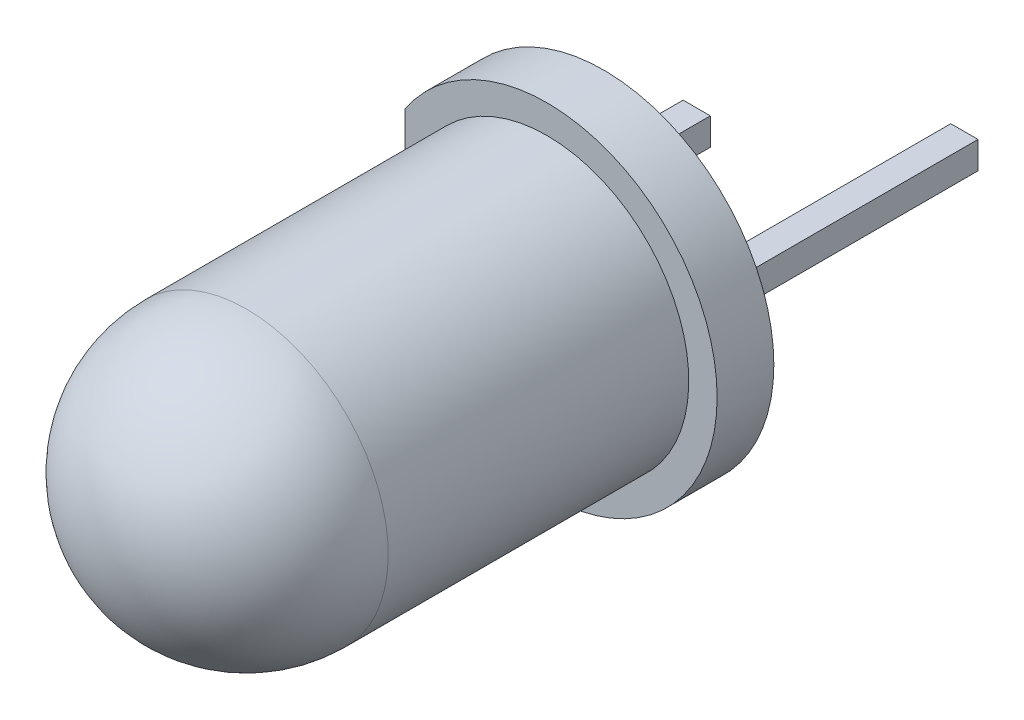
ISO-10303-21;
HEADER;
FILE_DESCRIPTION(('STEP AP214'),'2;1');
FILE_NAME('part.step','',(''),(''),'','','');
FILE_SCHEMA(('AUTOMOTIVE_DESIGN { 1 0 10303 214 1 1 1 1 }'));
ENDSEC;
DATA;
#1=APPLICATION_CONTEXT('core data for automotive mechanical design processes');
#2=APPLICATION_PROTOCOL_DEFINITION('international standard','automotive_design',2000,#1);
#3=PRODUCT_CONTEXT('',#1,'mechanical');
#4=PRODUCT('Part','Part','',(#3));
#5=PRODUCT_RELATED_PRODUCT_CATEGORY('part','',(#4));
#6=PRODUCT_DEFINITION_FORMATION('','',#4);
#7=PRODUCT_DEFINITION_CONTEXT('part definition',#1,'design');
#8=PRODUCT_DEFINITION('design','',#6,#7);
#9=PRODUCT_DEFINITION_SHAPE('','',#8);
#10=(LENGTH_UNIT() NAMED_UNIT(*) SI_UNIT(.MILLI.,.METRE.));
#11=(NAMED_UNIT(*) PLANE_ANGLE_UNIT() SI_UNIT($,.RADIAN.));
#12=(NAMED_UNIT(*) SI_UNIT($,.STERADIAN.) SOLID_ANGLE_UNIT());
#13=UNCERTAINTY_MEASURE_WITH_UNIT(LENGTH_MEASURE(1.E-05),#10,'distance_accuracy_value','');
#14=(GEOMETRIC_REPRESENTATION_CONTEXT(3) GLOBAL_UNCERTAINTY_ASSIGNED_CONTEXT((#13)) GLOBAL_UNIT_ASSIGNED_CONTEXT((#10,
#11,#12)) REPRESENTATION_CONTEXT('',''));
#15=CARTESIAN_POINT('',(0.,0.,0.));
#16=DIRECTION('',(0.,0.,1.));
#17=DIRECTION('',(1.,0.,0.));
#18=AXIS2_PLACEMENT_3D('',#15,#16,#17);
#19=CARTESIAN_POINT('',(-0.0499999999999997,0.,4.26666666666667));
#20=DIRECTION('',(0.,0.,1.));
#21=DIRECTION('',(-1.,0.,0.));
#22=AXIS2_PLACEMENT_3D('',#19,#20,#21);
#23=SPHERICAL_SURFACE('',#22,0.566666666666667);
#24=CARTESIAN_POINT('',(-0.0499999999999997,-0.24,4.26666666666667));
#25=DIRECTION('',(0.,1.,0.));
#26=DIRECTION('',(0.,0.,1.));
#27=AXIS2_PLACEMENT_3D('',#24,#25,#26);
#28=CIRCLE('',#27,0.513333333333333);
#29=CARTESIAN_POINT('',(-0.488634243989226,-0.24,4.));
#30=VERTEX_POINT('',#29);
#31=CARTESIAN_POINT('',(0.388634243989226,-0.24,4.));
#32=VERTEX_POINT('',#31);
#33=EDGE_CURVE('E161',#30,#32,#28,.F.);
#34=ORIENTED_EDGE('',*,*,#33,.T.);
#35=CARTESIAN_POINT('',(-0.0499999999999997,0.,4.));
#36=DIRECTION('',(0.,0.,1.));
#37=DIRECTION('',(1.,0.,0.));
#38=AXIS2_PLACEMENT_3D('',#35,#36,#37);
#39=CIRCLE('',#38,0.5);
#40=EDGE_CURVE('E56',#30,#32,#39,.T.);
#41=ORIENTED_EDGE('',*,*,#40,.F.);
#42=EDGE_LOOP('',(#34,#41));
#43=FACE_BOUND('',#42,.T.);
#44=ADVANCED_FACE('F48',(#43),#23,.T.);
#45=CARTESIAN_POINT('',(0.388634243989226,0.24,4.));
#46=VERTEX_POINT('',#45);
#47=CARTESIAN_POINT('',(-0.488634243989226,0.24,4.));
#48=VERTEX_POINT('',#47);
#49=EDGE_CURVE('E12',#46,#48,#39,.T.);
#50=ORIENTED_EDGE('',*,*,#49,.F.);
#51=CARTESIAN_POINT('',(-0.0499999999999997,0.24,4.26666666666667));
#52=DIRECTION('',(0.,1.,0.));
#53=DIRECTION('',(0.,0.,1.));
#54=AXIS2_PLACEMENT_3D('',#51,#52,#53);
#55=CIRCLE('',#54,0.513333333333333);
#56=EDGE_CURVE('E183',#48,#46,#55,.F.);
#57=ORIENTED_EDGE('',*,*,#56,.F.);
#58=EDGE_LOOP('',(#50,#57));
#59=FACE_BOUND('',#58,.T.);
#60=ADVANCED_FACE('F50',(#59),#23,.T.);
#61=CARTESIAN_POINT('',(-0.55,0.,4.));
#62=DIRECTION('',(0.,0.,-1.));
#63=DIRECTION('',(-1.,0.,0.));
#64=AXIS2_PLACEMENT_3D('',#61,#62,#63);
#65=PLANE('',#64);
#66=CARTESIAN_POINT('',(-0.0499999999999997,0.,4.));
#67=DIRECTION('',(0.,0.,1.));
#68=DIRECTION('',(1.,0.,0.));
#69=AXIS2_PLACEMENT_3D('',#66,#67,#68);
#70=CIRCLE('',#69,0.2);
#71=CARTESIAN_POINT('',(0.15,0.,4.));
#72=VERTEX_POINT('',#71);
#73=EDGE_CURVE('E256',#72,#72,#70,.T.);
#74=ORIENTED_EDGE('',*,*,#73,.F.);
#75=EDGE_LOOP('',(#74));
#76=FACE_BOUND('',#75,.T.);
#77=ORIENTED_EDGE('',*,*,#49,.T.);
#78=DIRECTION('',(1.,0.,0.));
#79=VECTOR('',#78,1.);
#80=CARTESIAN_POINT('',(-1.3,0.24,4.));
#81=LINE('',#80,#79);
#82=CARTESIAN_POINT('',(-1.3,0.24,4.));
#83=VERTEX_POINT('',#82);
#84=EDGE_CURVE('E102',#83,#48,#81,.T.);
#85=ORIENTED_EDGE('',*,*,#84,.F.);
#86=DIRECTION('',(0.,-1.,0.));
#87=VECTOR('',#86,1.);
#88=CARTESIAN_POINT('',(-1.3,0.24,4.));
#89=LINE('',#88,#87);
#90=CARTESIAN_POINT('',(-1.3,-0.24,4.));
#91=VERTEX_POINT('',#90);
#92=EDGE_CURVE('E160',#83,#91,#89,.T.);
#93=ORIENTED_EDGE('',*,*,#92,.T.);
#94=DIRECTION('',(1.,0.,0.));
#95=VECTOR('',#94,1.);
#96=CARTESIAN_POINT('',(-1.3,-0.24,4.));
#97=LINE('',#96,#95);
#98=EDGE_CURVE('E63',#91,#30,#97,.T.);
#99=ORIENTED_EDGE('',*,*,#98,.T.);
#100=ORIENTED_EDGE('',*,*,#40,.T.);
#101=CARTESIAN_POINT('',(1.2,-0.24,4.));
#102=VERTEX_POINT('',#101);
#103=EDGE_CURVE('E146',#32,#102,#97,.T.);
#104=ORIENTED_EDGE('',*,*,#103,.T.);
#105=DIRECTION('',(0.,-1.,0.));
#106=VECTOR('',#105,1.);
#107=CARTESIAN_POINT('',(1.2,0.24,4.));
#108=LINE('',#107,#106);
#109=CARTESIAN_POINT('',(1.2,0.24,4.));
#110=VERTEX_POINT('',#109);
#111=EDGE_CURVE('E130',#110,#102,#108,.T.);
#112=ORIENTED_EDGE('',*,*,#111,.F.);
#113=EDGE_CURVE('E118',#46,#110,#81,.T.);
#114=ORIENTED_EDGE('',*,*,#113,.F.);
#115=EDGE_LOOP('',(#77,#85,#93,#99,#100,#104,#112,#114));
#116=FACE_BOUND('',#115,.T.);
#117=ADVANCED_FACE('F166',(#76,#116),#65,.F.);
#118=CARTESIAN_POINT('',(0.,0.24,0.));
#119=DIRECTION('',(0.,1.,0.));
#120=DIRECTION('',(0.,0.,1.));
#121=AXIS2_PLACEMENT_3D('',#118,#119,#120);
#122=PLANE('',#121);
#123=ORIENTED_EDGE('',*,*,#84,.T.);
#124=ORIENTED_EDGE('',*,*,#56,.T.);
#125=ORIENTED_EDGE('',*,*,#113,.T.);
#126=DIRECTION('',(-0.508148861978286,0.,-0.861269257590315));
#127=VECTOR('',#126,1.);
#128=CARTESIAN_POINT('',(1.2,0.24,4.));
#129=LINE('',#128,#127);
#130=CARTESIAN_POINT('',(0.0199999999999998,0.24,2.));
#131=VERTEX_POINT('',#130);
#132=EDGE_CURVE('E109',#110,#131,#129,.T.);
#133=ORIENTED_EDGE('',*,*,#132,.T.);
#134=DIRECTION('',(-1.,0.,0.));
#135=VECTOR('',#134,1.);
#136=CARTESIAN_POINT('',(0.0199999999999998,0.24,2.));
#137=LINE('',#136,#135);
#138=CARTESIAN_POINT('',(-1.12,0.24,2.));
#139=VERTEX_POINT('',#138);
#140=EDGE_CURVE('E114',#131,#139,#137,.T.);
#141=ORIENTED_EDGE('',*,*,#140,.T.);
#142=DIRECTION('',(0.,0.,-1.));
#143=VECTOR('',#142,1.);
#144=CARTESIAN_POINT('',(-1.12,0.24,2.));
#145=LINE('',#144,#143);
#146=CARTESIAN_POINT('',(-1.12,0.24,-3.));
#147=VERTEX_POINT('',#146);
#148=EDGE_CURVE('E136',#139,#147,#145,.T.);
#149=ORIENTED_EDGE('',*,*,#148,.T.);
#150=DIRECTION('',(1.,0.,0.));
#151=VECTOR('',#150,1.);
#152=CARTESIAN_POINT('',(-1.12,0.24,-3.));
#153=LINE('',#152,#151);
#154=CARTESIAN_POINT('',(-1.6,0.24,-3.));
#155=VERTEX_POINT('',#154);
#156=EDGE_CURVE('E147',#155,#147,#153,.T.);
#157=ORIENTED_EDGE('',*,*,#156,.F.);
#158=DIRECTION('',(0.,0.,1.));
#159=VECTOR('',#158,1.);
#160=CARTESIAN_POINT('',(-1.6,0.24,0.));
#161=LINE('',#160,#159);
#162=CARTESIAN_POINT('',(-1.6,0.24,3.5));
#163=VERTEX_POINT('',#162);
#164=EDGE_CURVE('E72',#155,#163,#161,.T.);
#165=ORIENTED_EDGE('',*,*,#164,.T.);
#166=DIRECTION('',(0.514495755427526,0.,0.857492925712544));
#167=VECTOR('',#166,1.);
#168=CARTESIAN_POINT('',(-1.6,0.24,3.5));
#169=LINE('',#168,#167);
#170=EDGE_CURVE('E156',#163,#83,#169,.T.);
#171=ORIENTED_EDGE('',*,*,#170,.T.);
#172=EDGE_LOOP('',(#123,#124,#125,#133,#141,#149,#157,#165,#171));
#173=FACE_BOUND('',#172,.T.);
#174=ADVANCED_FACE('F111',(#173),#122,.T.);
#175=CARTESIAN_POINT('',(0.,-0.24,0.));
#176=DIRECTION('',(0.,1.,0.));
#177=DIRECTION('',(0.,0.,1.));
#178=AXIS2_PLACEMENT_3D('',#175,#176,#177);
#179=PLANE('',#178);
#180=ORIENTED_EDGE('',*,*,#33,.F.);
#181=ORIENTED_EDGE('',*,*,#98,.F.);
#182=DIRECTION('',(0.514495755427526,0.,0.857492925712544));
#183=VECTOR('',#182,1.);
#184=CARTESIAN_POINT('',(-1.6,-0.24,3.5));
#185=LINE('',#184,#183);
#186=CARTESIAN_POINT('',(-1.6,-0.24,3.5));
#187=VERTEX_POINT('',#186);
#188=EDGE_CURVE('E143',#187,#91,#185,.T.);
#189=ORIENTED_EDGE('',*,*,#188,.F.);
#190=DIRECTION('',(0.,0.,1.));
#191=VECTOR('',#190,1.);
#192=CARTESIAN_POINT('',(-1.6,-0.24,0.));
#193=LINE('',#192,#191);
#194=CARTESIAN_POINT('',(-1.6,-0.24,-3.));
#195=VERTEX_POINT('',#194);
#196=EDGE_CURVE('E96',#195,#187,#193,.T.);
#197=ORIENTED_EDGE('',*,*,#196,.F.);
#198=DIRECTION('',(-1.,0.,0.));
#199=VECTOR('',#198,1.);
#200=CARTESIAN_POINT('',(-1.12,-0.24,-3.));
#201=LINE('',#200,#199);
#202=CARTESIAN_POINT('',(-1.12,-0.24,-3.));
#203=VERTEX_POINT('',#202);
#204=EDGE_CURVE('E204',#203,#195,#201,.T.);
#205=ORIENTED_EDGE('',*,*,#204,.F.);
#206=DIRECTION('',(0.,0.,-1.));
#207=VECTOR('',#206,1.);
#208=CARTESIAN_POINT('',(-1.12,-0.24,2.));
#209=LINE('',#208,#207);
#210=CARTESIAN_POINT('',(-1.12,-0.24,2.));
#211=VERTEX_POINT('',#210);
#212=EDGE_CURVE('E152',#211,#203,#209,.T.);
#213=ORIENTED_EDGE('',*,*,#212,.F.);
#214=DIRECTION('',(-1.,0.,0.));
#215=VECTOR('',#214,1.);
#216=CARTESIAN_POINT('',(0.0199999999999998,-0.24,2.));
#217=LINE('',#216,#215);
#218=CARTESIAN_POINT('',(0.0199999999999998,-0.24,2.));
#219=VERTEX_POINT('',#218);
#220=EDGE_CURVE('E150',#219,#211,#217,.T.);
#221=ORIENTED_EDGE('',*,*,#220,.F.);
#222=DIRECTION('',(-0.508148861978286,0.,-0.861269257590315));
#223=VECTOR('',#222,1.);
#224=CARTESIAN_POINT('',(1.2,-0.24,4.));
#225=LINE('',#224,#223);
#226=EDGE_CURVE('E127',#102,#219,#225,.T.);
#227=ORIENTED_EDGE('',*,*,#226,.F.);
#228=ORIENTED_EDGE('',*,*,#103,.F.);
#229=EDGE_LOOP('',(#180,#181,#189,#197,#205,#213,#221,#227,#228));
#230=FACE_BOUND('',#229,.T.);
#231=ADVANCED_FACE('F218',(#230),#179,.F.);
#232=CARTESIAN_POINT('',(-1.6,0.24,3.5));
#233=DIRECTION('',(0.857492925712544,0.,-0.514495755427526));
#234=DIRECTION('',(-0.514495755427526,0.,-0.857492925712544));
#235=AXIS2_PLACEMENT_3D('',#232,#233,#234);
#236=PLANE('',#235);
#237=ORIENTED_EDGE('',*,*,#188,.T.);
#238=ORIENTED_EDGE('',*,*,#92,.F.);
#239=ORIENTED_EDGE('',*,*,#170,.F.);
#240=DIRECTION('',(0.,-1.,0.));
#241=VECTOR('',#240,1.);
#242=CARTESIAN_POINT('',(-1.6,0.24,3.5));
#243=LINE('',#242,#241);
#244=EDGE_CURVE('E142',#163,#187,#243,.T.);
#245=ORIENTED_EDGE('',*,*,#244,.T.);
#246=EDGE_LOOP('',(#237,#238,#239,#245));
#247=FACE_BOUND('',#246,.T.);
#248=ADVANCED_FACE('F215',(#247),#236,.F.);
#249=CARTESIAN_POINT('',(1.2,0.24,4.));
#250=DIRECTION('',(-0.861269257590315,0.,0.508148861978286));
#251=DIRECTION('',(0.508148861978286,0.,0.861269257590315));
#252=AXIS2_PLACEMENT_3D('',#249,#250,#251);
#253=PLANE('',#252);
#254=ORIENTED_EDGE('',*,*,#226,.T.);
#255=DIRECTION('',(0.,-1.,0.));
#256=VECTOR('',#255,1.);
#257=CARTESIAN_POINT('',(0.0199999999999998,0.24,2.));
#258=LINE('',#257,#256);
#259=EDGE_CURVE('E124',#131,#219,#258,.T.);
#260=ORIENTED_EDGE('',*,*,#259,.F.);
#261=ORIENTED_EDGE('',*,*,#132,.F.);
#262=ORIENTED_EDGE('',*,*,#111,.T.);
#263=EDGE_LOOP('',(#254,#260,#261,#262));
#264=FACE_BOUND('',#263,.T.);
#265=ADVANCED_FACE('F125',(#264),#253,.F.);
#266=CARTESIAN_POINT('',(0.0199999999999998,0.24,2.));
#267=DIRECTION('',(0.,0.,1.));
#268=DIRECTION('',(1.,0.,0.));
#269=AXIS2_PLACEMENT_3D('',#266,#267,#268);
#270=PLANE('',#269);
#271=ORIENTED_EDGE('',*,*,#220,.T.);
#272=DIRECTION('',(0.,-1.,0.));
#273=VECTOR('',#272,1.);
#274=CARTESIAN_POINT('',(-1.12,0.24,2.));
#275=LINE('',#274,#273);
#276=EDGE_CURVE('E131',#139,#211,#275,.T.);
#277=ORIENTED_EDGE('',*,*,#276,.F.);
#278=ORIENTED_EDGE('',*,*,#140,.F.);
#279=ORIENTED_EDGE('',*,*,#259,.T.);
#280=EDGE_LOOP('',(#271,#277,#278,#279));
#281=FACE_BOUND('',#280,.T.);
#282=ADVANCED_FACE('F133',(#281),#270,.F.);
#283=CARTESIAN_POINT('',(-1.12,0.24,2.));
#284=DIRECTION('',(-1.,0.,0.));
#285=DIRECTION('',(0.,0.,1.));
#286=AXIS2_PLACEMENT_3D('',#283,#284,#285);
#287=PLANE('',#286);
#288=ORIENTED_EDGE('',*,*,#212,.T.);
#289=DIRECTION('',(0.,-1.,0.));
#290=VECTOR('',#289,1.);
#291=CARTESIAN_POINT('',(-1.12,-0.24,-3.));
#292=LINE('',#291,#290);
#293=EDGE_CURVE('E198',#147,#203,#292,.T.);
#294=ORIENTED_EDGE('',*,*,#293,.F.);
#295=ORIENTED_EDGE('',*,*,#148,.F.);
#296=ORIENTED_EDGE('',*,*,#276,.T.);
#297=EDGE_LOOP('',(#288,#294,#295,#296));
#298=FACE_BOUND('',#297,.T.);
#299=ADVANCED_FACE('F201',(#298),#287,.F.);
#300=CARTESIAN_POINT('',(-1.6,0.24,0.));
#301=DIRECTION('',(1.,0.,0.));
#302=DIRECTION('',(0.,0.,-1.));
#303=AXIS2_PLACEMENT_3D('',#300,#301,#302);
#304=PLANE('',#303);
#305=ORIENTED_EDGE('',*,*,#196,.T.);
#306=ORIENTED_EDGE('',*,*,#244,.F.);
#307=ORIENTED_EDGE('',*,*,#164,.F.);
#308=DIRECTION('',(0.,1.,0.));
#309=VECTOR('',#308,1.);
#310=CARTESIAN_POINT('',(-1.6,-0.24,-3.));
#311=LINE('',#310,#309);
#312=EDGE_CURVE('E199',#195,#155,#311,.T.);
#313=ORIENTED_EDGE('',*,*,#312,.F.);
#314=EDGE_LOOP('',(#305,#306,#307,#313));
#315=FACE_BOUND('',#314,.T.);
#316=ADVANCED_FACE('F219',(#315),#304,.F.);
#317=CARTESIAN_POINT('',(0.,0.,-3.));
#318=DIRECTION('',(0.,0.,1.));
#319=DIRECTION('',(1.,0.,0.));
#320=AXIS2_PLACEMENT_3D('',#317,#318,#319);
#321=PLANE('',#320);
#322=ORIENTED_EDGE('',*,*,#293,.T.);
#323=ORIENTED_EDGE('',*,*,#204,.T.);
#324=ORIENTED_EDGE('',*,*,#312,.T.);
#325=ORIENTED_EDGE('',*,*,#156,.T.);
#326=EDGE_LOOP('',(#322,#323,#324,#325));
#327=FACE_BOUND('',#326,.T.);
#328=ADVANCED_FACE('F196',(#327),#321,.F.);
#329=CARTESIAN_POINT('',(-0.0499999999999997,0.,3.9));
#330=DIRECTION('',(0.,0.,1.));
#331=DIRECTION('',(1.,0.,0.));
#332=AXIS2_PLACEMENT_3D('',#329,#330,#331);
#333=CYLINDRICAL_SURFACE('',#332,0.2);
#334=CARTESIAN_POINT('',(-0.0499999999999997,0.,3.9));
#335=DIRECTION('',(0.,0.,1.));
#336=DIRECTION('',(1.,0.,0.));
#337=AXIS2_PLACEMENT_3D('',#334,#335,#336);
#338=CIRCLE('',#337,0.2);
#339=CARTESIAN_POINT('',(0.15,0.,3.9));
#340=VERTEX_POINT('',#339);
#341=EDGE_CURVE('E207',#340,#340,#338,.T.);
#342=ORIENTED_EDGE('',*,*,#341,.F.);
#343=EDGE_LOOP('',(#342));
#344=FACE_BOUND('',#343,.T.);
#345=ORIENTED_EDGE('',*,*,#73,.T.);
#346=EDGE_LOOP('',(#345));
#347=FACE_BOUND('',#346,.T.);
#348=ADVANCED_FACE('F226',(#344,#347),#333,.F.);
#349=CARTESIAN_POINT('',(-0.0499999999999997,0.,3.9));
#350=DIRECTION('',(0.,0.,1.));
#351=DIRECTION('',(1.,0.,0.));
#352=AXIS2_PLACEMENT_3D('',#349,#350,#351);
#353=PLANE('',#352);
#354=ORIENTED_EDGE('',*,*,#341,.T.);
#355=EDGE_LOOP('',(#354));
#356=FACE_BOUND('',#355,.T.);
#357=ADVANCED_FACE('F248',(#356),#353,.T.);
#358=CLOSED_SHELL('',(#44,#60,#117,#174,#231,#248,#265,#282,#299,#316,#328,#348,#357));
#359=MANIFOLD_SOLID_BREP('B2',#358);
#360=CARTESIAN_POINT('',(1.12,0.24,2.));
#361=DIRECTION('',(0.,0.,1.));
#362=DIRECTION('',(1.,0.,0.));
#363=AXIS2_PLACEMENT_3D('',#360,#361,#362);
#364=PLANE('',#363);
#365=DIRECTION('',(-1.,0.,0.));
#366=VECTOR('',#365,1.);
#367=CARTESIAN_POINT('',(1.12,-0.24,2.));
#368=LINE('',#367,#366);
#369=CARTESIAN_POINT('',(1.12,-0.24,2.));
#370=VERTEX_POINT('',#369);
#371=CARTESIAN_POINT('',(0.22,-0.24,2.));
#372=VERTEX_POINT('',#371);
#373=EDGE_CURVE('E454',#370,#372,#368,.T.);
#374=ORIENTED_EDGE('',*,*,#373,.T.);
#375=DIRECTION('',(0.,-1.,0.));
#376=VECTOR('',#375,1.);
#377=CARTESIAN_POINT('',(0.22,0.24,2.));
#378=LINE('',#377,#376);
#379=CARTESIAN_POINT('',(0.22,0.24,2.));
#380=VERTEX_POINT('',#379);
#381=EDGE_CURVE('E46',#380,#372,#378,.T.);
#382=ORIENTED_EDGE('',*,*,#381,.F.);
#383=DIRECTION('',(-1.,0.,0.));
#384=VECTOR('',#383,1.);
#385=CARTESIAN_POINT('',(1.12,0.24,2.));
#386=LINE('',#385,#384);
#387=CARTESIAN_POINT('',(1.12,0.24,2.));
#388=VERTEX_POINT('',#387);
#389=EDGE_CURVE('E455',#388,#380,#386,.T.);
#390=ORIENTED_EDGE('',*,*,#389,.F.);
#391=DIRECTION('',(0.,-1.,0.));
#392=VECTOR('',#391,1.);
#393=CARTESIAN_POINT('',(1.12,0.24,2.));
#394=LINE('',#393,#392);
#395=EDGE_CURVE('E460',#388,#370,#394,.T.);
#396=ORIENTED_EDGE('',*,*,#395,.T.);
#397=EDGE_LOOP('',(#374,#382,#390,#396));
#398=FACE_BOUND('',#397,.T.);
#399=ADVANCED_FACE('F368',(#398),#364,.F.);
#400=CARTESIAN_POINT('',(0.22,0.24,2.));
#401=DIRECTION('',(0.861269257590315,0.,-0.508148861978286));
#402=DIRECTION('',(-0.508148861978286,0.,-0.861269257590315));
#403=AXIS2_PLACEMENT_3D('',#400,#401,#402);
#404=PLANE('',#403);
#405=DIRECTION('',(0.508148861978286,0.,0.861269257590315));
#406=VECTOR('',#405,1.);
#407=CARTESIAN_POINT('',(0.22,-0.24,2.));
#408=LINE('',#407,#406);
#409=CARTESIAN_POINT('',(1.4,-0.24,4.));
#410=VERTEX_POINT('',#409);
#411=EDGE_CURVE('E463',#372,#410,#408,.T.);
#412=ORIENTED_EDGE('',*,*,#411,.T.);
#413=DIRECTION('',(0.,-1.,0.));
#414=VECTOR('',#413,1.);
#415=CARTESIAN_POINT('',(1.4,0.24,4.));
#416=LINE('',#415,#414);
#417=CARTESIAN_POINT('',(1.4,0.24,4.));
#418=VERTEX_POINT('',#417);
#419=EDGE_CURVE('E376',#418,#410,#416,.T.);
#420=ORIENTED_EDGE('',*,*,#419,.F.);
#421=DIRECTION('',(0.508148861978286,0.,0.861269257590315));
#422=VECTOR('',#421,1.);
#423=CARTESIAN_POINT('',(0.22,0.24,2.));
#424=LINE('',#423,#422);
#425=EDGE_CURVE('E417',#380,#418,#424,.T.);
#426=ORIENTED_EDGE('',*,*,#425,.F.);
#427=ORIENTED_EDGE('',*,*,#381,.T.);
#428=EDGE_LOOP('',(#412,#420,#426,#427));
#429=FACE_BOUND('',#428,.T.);
#430=ADVANCED_FACE('F478',(#429),#404,.F.);
#431=CARTESIAN_POINT('',(1.4,0.24,4.));
#432=DIRECTION('',(0.,0.,-1.));
#433=DIRECTION('',(-1.,0.,0.));
#434=AXIS2_PLACEMENT_3D('',#431,#432,#433);
#435=PLANE('',#434);
#436=DIRECTION('',(1.,0.,0.));
#437=VECTOR('',#436,1.);
#438=CARTESIAN_POINT('',(1.4,-0.24,4.));
#439=LINE('',#438,#437);
#440=CARTESIAN_POINT('',(1.6,-0.24,4.));
#441=VERTEX_POINT('',#440);
#442=EDGE_CURVE('E403',#410,#441,#439,.T.);
#443=ORIENTED_EDGE('',*,*,#442,.T.);
#444=DIRECTION('',(0.,-1.,0.));
#445=VECTOR('',#444,1.);
#446=CARTESIAN_POINT('',(1.6,0.24,4.));
#447=LINE('',#446,#445);
#448=CARTESIAN_POINT('',(1.6,0.24,4.));
#449=VERTEX_POINT('',#448);
#450=EDGE_CURVE('E469',#449,#441,#447,.T.);
#451=ORIENTED_EDGE('',*,*,#450,.F.);
#452=DIRECTION('',(1.,0.,0.));
#453=VECTOR('',#452,1.);
#454=CARTESIAN_POINT('',(1.4,0.24,4.));
#455=LINE('',#454,#453);
#456=EDGE_CURVE('E434',#418,#449,#455,.T.);
#457=ORIENTED_EDGE('',*,*,#456,.F.);
#458=ORIENTED_EDGE('',*,*,#419,.T.);
#459=EDGE_LOOP('',(#443,#451,#457,#458));
#460=FACE_BOUND('',#459,.T.);
#461=ADVANCED_FACE('F470',(#460),#435,.F.);
#462=CARTESIAN_POINT('',(1.6,0.24,4.));
#463=DIRECTION('',(-1.,0.,0.));
#464=DIRECTION('',(0.,0.,1.));
#465=AXIS2_PLACEMENT_3D('',#462,#463,#464);
#466=PLANE('',#465);
#467=DIRECTION('',(0.,0.,-1.));
#468=VECTOR('',#467,1.);
#469=CARTESIAN_POINT('',(1.6,-0.24,4.));
#470=LINE('',#469,#468);
#471=CARTESIAN_POINT('',(1.6,-0.24,-5.));
#472=VERTEX_POINT('',#471);
#473=EDGE_CURVE('E441',#441,#472,#470,.T.);
#474=ORIENTED_EDGE('',*,*,#473,.T.);
#475=DIRECTION('',(0.,-1.,0.));
#476=VECTOR('',#475,1.);
#477=CARTESIAN_POINT('',(1.6,0.24,-5.));
#478=LINE('',#477,#476);
#479=CARTESIAN_POINT('',(1.6,0.24,-5.));
#480=VERTEX_POINT('',#479);
#481=EDGE_CURVE('E438',#480,#472,#478,.T.);
#482=ORIENTED_EDGE('',*,*,#481,.F.);
#483=DIRECTION('',(0.,0.,-1.));
#484=VECTOR('',#483,1.);
#485=CARTESIAN_POINT('',(1.6,0.24,4.));
#486=LINE('',#485,#484);
#487=EDGE_CURVE('E428',#449,#480,#486,.T.);
#488=ORIENTED_EDGE('',*,*,#487,.F.);
#489=ORIENTED_EDGE('',*,*,#450,.T.);
#490=EDGE_LOOP('',(#474,#482,#488,#489));
#491=FACE_BOUND('',#490,.T.);
#492=ADVANCED_FACE('F439',(#491),#466,.F.);
#493=CARTESIAN_POINT('',(1.12,0.24,0.));
#494=DIRECTION('',(1.,0.,0.));
#495=DIRECTION('',(0.,0.,-1.));
#496=AXIS2_PLACEMENT_3D('',#493,#494,#495);
#497=PLANE('',#496);
#498=DIRECTION('',(0.,0.,1.));
#499=VECTOR('',#498,1.);
#500=CARTESIAN_POINT('',(1.12,-0.24,0.));
#501=LINE('',#500,#499);
#502=CARTESIAN_POINT('',(1.12,-0.24,-5.));
#503=VERTEX_POINT('',#502);
#504=EDGE_CURVE('E410',#503,#370,#501,.T.);
#505=ORIENTED_EDGE('',*,*,#504,.T.);
#506=ORIENTED_EDGE('',*,*,#395,.F.);
#507=DIRECTION('',(0.,0.,1.));
#508=VECTOR('',#507,1.);
#509=CARTESIAN_POINT('',(1.12,0.24,0.));
#510=LINE('',#509,#508);
#511=CARTESIAN_POINT('',(1.12,0.24,-5.));
#512=VERTEX_POINT('',#511);
#513=EDGE_CURVE('E384',#512,#388,#510,.T.);
#514=ORIENTED_EDGE('',*,*,#513,.F.);
#515=DIRECTION('',(0.,1.,0.));
#516=VECTOR('',#515,1.);
#517=CARTESIAN_POINT('',(1.12,-0.24,-5.));
#518=LINE('',#517,#516);
#519=EDGE_CURVE('E449',#503,#512,#518,.T.);
#520=ORIENTED_EDGE('',*,*,#519,.F.);
#521=EDGE_LOOP('',(#505,#506,#514,#520));
#522=FACE_BOUND('',#521,.T.);
#523=ADVANCED_FACE('F474',(#522),#497,.F.);
#524=CARTESIAN_POINT('',(0.,0.24,0.));
#525=DIRECTION('',(0.,-1.,0.));
#526=DIRECTION('',(0.,0.,-1.));
#527=AXIS2_PLACEMENT_3D('',#524,#525,#526);
#528=PLANE('',#527);
#529=ORIENTED_EDGE('',*,*,#389,.T.);
#530=ORIENTED_EDGE('',*,*,#425,.T.);
#531=ORIENTED_EDGE('',*,*,#456,.T.);
#532=ORIENTED_EDGE('',*,*,#487,.T.);
#533=DIRECTION('',(1.,0.,0.));
#534=VECTOR('',#533,1.);
#535=CARTESIAN_POINT('',(1.12,0.24,-5.));
#536=LINE('',#535,#534);
#537=EDGE_CURVE('E432',#512,#480,#536,.T.);
#538=ORIENTED_EDGE('',*,*,#537,.F.);
#539=ORIENTED_EDGE('',*,*,#513,.T.);
#540=EDGE_LOOP('',(#529,#530,#531,#532,#538,#539));
#541=FACE_BOUND('',#540,.T.);
#542=ADVANCED_FACE('F430',(#541),#528,.F.);
#543=CARTESIAN_POINT('',(0.,-0.24,0.));
#544=DIRECTION('',(0.,-1.,0.));
#545=DIRECTION('',(0.,0.,-1.));
#546=AXIS2_PLACEMENT_3D('',#543,#544,#545);
#547=PLANE('',#546);
#548=ORIENTED_EDGE('',*,*,#373,.F.);
#549=ORIENTED_EDGE('',*,*,#504,.F.);
#550=DIRECTION('',(-1.,0.,0.));
#551=VECTOR('',#550,1.);
#552=CARTESIAN_POINT('',(1.6,-0.24,-5.));
#553=LINE('',#552,#551);
#554=EDGE_CURVE('E445',#472,#503,#553,.T.);
#555=ORIENTED_EDGE('',*,*,#554,.F.);
#556=ORIENTED_EDGE('',*,*,#473,.F.);
#557=ORIENTED_EDGE('',*,*,#442,.F.);
#558=ORIENTED_EDGE('',*,*,#411,.F.);
#559=EDGE_LOOP('',(#548,#549,#555,#556,#557,#558));
#560=FACE_BOUND('',#559,.T.);
#561=ADVANCED_FACE('F473',(#560),#547,.T.);
#562=CARTESIAN_POINT('',(0.,0.,-5.));
#563=DIRECTION('',(0.,0.,-1.));
#564=DIRECTION('',(-1.,0.,0.));
#565=AXIS2_PLACEMENT_3D('',#562,#563,#564);
#566=PLANE('',#565);
#567=ORIENTED_EDGE('',*,*,#537,.T.);
#568=ORIENTED_EDGE('',*,*,#481,.T.);
#569=ORIENTED_EDGE('',*,*,#554,.T.);
#570=ORIENTED_EDGE('',*,*,#519,.T.);
#571=EDGE_LOOP('',(#567,#568,#569,#570));
#572=FACE_BOUND('',#571,.T.);
#573=ADVANCED_FACE('F448',(#572),#566,.T.);
#574=CLOSED_SHELL('',(#399,#430,#461,#492,#523,#542,#561,#573));
#575=MANIFOLD_SOLID_BREP('B6',#574);
#576=CARTESIAN_POINT('',(0.,0.,1.));
#577=DIRECTION('',(0.,0.,-1.));
#578=DIRECTION('',(-1.,0.,0.));
#579=AXIS2_PLACEMENT_3D('',#576,#577,#578);
#580=CYLINDRICAL_SURFACE('',#579,3.);
#581=CARTESIAN_POINT('',(0.,0.,1.));
#582=DIRECTION('',(0.,0.,1.));
#583=DIRECTION('',(1.,0.,0.));
#584=AXIS2_PLACEMENT_3D('',#581,#582,#583);
#585=CIRCLE('',#584,3.);
#586=CARTESIAN_POINT('',(-2.5,-1.6583123951777,1.));
#587=VERTEX_POINT('',#586);
#588=CARTESIAN_POINT('',(-2.5,1.6583123951777,1.));
#589=VERTEX_POINT('',#588);
#590=EDGE_CURVE('E580',#587,#589,#585,.T.);
#591=ORIENTED_EDGE('',*,*,#590,.F.);
#592=DIRECTION('',(0.,0.,-1.));
#593=VECTOR('',#592,1.);
#594=CARTESIAN_POINT('',(-2.5,-1.6583123951777,4.35410196624969));
#595=LINE('',#594,#593);
#596=CARTESIAN_POINT('',(-2.5,-1.6583123951777,0.));
#597=VERTEX_POINT('',#596);
#598=EDGE_CURVE('E778',#587,#597,#595,.T.);
#599=ORIENTED_EDGE('',*,*,#598,.T.);
#600=CARTESIAN_POINT('',(0.,0.,0.));
#601=DIRECTION('',(0.,0.,1.));
#602=DIRECTION('',(1.,0.,0.));
#603=AXIS2_PLACEMENT_3D('',#600,#601,#602);
#604=CIRCLE('',#603,3.);
#605=CARTESIAN_POINT('',(-2.5,1.6583123951777,0.));
#606=VERTEX_POINT('',#605);
#607=EDGE_CURVE('E786',#597,#606,#604,.T.);
#608=ORIENTED_EDGE('',*,*,#607,.T.);
#609=DIRECTION('',(0.,0.,-1.));
#610=VECTOR('',#609,1.);
#611=CARTESIAN_POINT('',(-2.5,1.6583123951777,4.35410196624969));
#612=LINE('',#611,#610);
#613=EDGE_CURVE('E781',#589,#606,#612,.T.);
#614=ORIENTED_EDGE('',*,*,#613,.F.);
#615=EDGE_LOOP('',(#591,#599,#608,#614));
#616=FACE_BOUND('',#615,.T.);
#617=ADVANCED_FACE('F573',(#616),#580,.T.);
#618=CARTESIAN_POINT('',(0.,0.,1.));
#619=DIRECTION('',(0.,0.,1.));
#620=DIRECTION('',(1.,0.,0.));
#621=AXIS2_PLACEMENT_3D('',#618,#619,#620);
#622=PLANE('',#621);
#623=DIRECTION('',(0.,-1.,0.));
#624=VECTOR('',#623,1.);
#625=CARTESIAN_POINT('',(-2.5,1.6583123951777,1.));
#626=LINE('',#625,#624);
#627=CARTESIAN_POINT('',(-2.5,0.,1.));
#628=VERTEX_POINT('',#627);
#629=EDGE_CURVE('E774',#628,#587,#626,.T.);
#630=ORIENTED_EDGE('',*,*,#629,.T.);
#631=ORIENTED_EDGE('',*,*,#590,.T.);
#632=EDGE_CURVE('E775',#589,#628,#626,.T.);
#633=ORIENTED_EDGE('',*,*,#632,.T.);
#634=CARTESIAN_POINT('',(0.,0.,1.));
#635=DIRECTION('',(0.,0.,1.));
#636=DIRECTION('',(1.,0.,0.));
#637=AXIS2_PLACEMENT_3D('',#634,#635,#636);
#638=CIRCLE('',#637,2.5);
#639=EDGE_CURVE('E366',#628,#628,#638,.T.);
#640=ORIENTED_EDGE('',*,*,#639,.F.);
#641=EDGE_LOOP('',(#630,#631,#633,#640));
#642=FACE_BOUND('',#641,.T.);
#643=ADVANCED_FACE('F800',(#642),#622,.T.);
#644=CARTESIAN_POINT('',(0.,0.,0.));
#645=DIRECTION('',(0.,0.,1.));
#646=DIRECTION('',(1.,0.,0.));
#647=AXIS2_PLACEMENT_3D('',#644,#645,#646);
#648=PLANE('',#647);
#649=DIRECTION('',(0.,1.,0.));
#650=VECTOR('',#649,1.);
#651=CARTESIAN_POINT('',(1.12,-0.24,0.));
#652=LINE('',#651,#650);
#653=CARTESIAN_POINT('',(1.12,-0.24,0.));
#654=VERTEX_POINT('',#653);
#655=CARTESIAN_POINT('',(1.12,0.24,0.));
#656=VERTEX_POINT('',#655);
#657=EDGE_CURVE('E687',#654,#656,#652,.T.);
#658=ORIENTED_EDGE('',*,*,#657,.F.);
#659=DIRECTION('',(-1.,0.,0.));
#660=VECTOR('',#659,1.);
#661=CARTESIAN_POINT('',(1.12,-0.24,0.));
#662=LINE('',#661,#660);
#663=CARTESIAN_POINT('',(1.6,-0.24,0.));
#664=VERTEX_POINT('',#663);
#665=EDGE_CURVE('E694',#664,#654,#662,.T.);
#666=ORIENTED_EDGE('',*,*,#665,.F.);
#667=DIRECTION('',(0.,1.,0.));
#668=VECTOR('',#667,1.);
#669=CARTESIAN_POINT('',(1.6,-0.24,0.));
#670=LINE('',#669,#668);
#671=CARTESIAN_POINT('',(1.6,0.24,0.));
#672=VERTEX_POINT('',#671);
#673=EDGE_CURVE('E742',#664,#672,#670,.T.);
#674=ORIENTED_EDGE('',*,*,#673,.T.);
#675=DIRECTION('',(-1.,0.,0.));
#676=VECTOR('',#675,1.);
#677=CARTESIAN_POINT('',(1.12,0.24,0.));
#678=LINE('',#677,#676);
#679=EDGE_CURVE('E708',#672,#656,#678,.T.);
#680=ORIENTED_EDGE('',*,*,#679,.T.);
#681=EDGE_LOOP('',(#658,#666,#674,#680));
#682=FACE_BOUND('',#681,.T.);
#683=DIRECTION('',(0.,1.,0.));
#684=VECTOR('',#683,1.);
#685=CARTESIAN_POINT('',(-1.6,-0.24,0.));
#686=LINE('',#685,#684);
#687=CARTESIAN_POINT('',(-1.6,-0.24,0.));
#688=VERTEX_POINT('',#687);
#689=CARTESIAN_POINT('',(-1.6,0.24,0.));
#690=VERTEX_POINT('',#689);
#691=EDGE_CURVE('E738',#688,#690,#686,.T.);
#692=ORIENTED_EDGE('',*,*,#691,.F.);
#693=DIRECTION('',(-1.,0.,0.));
#694=VECTOR('',#693,1.);
#695=CARTESIAN_POINT('',(-1.6,-0.24,0.));
#696=LINE('',#695,#694);
#697=CARTESIAN_POINT('',(-1.12,-0.24,0.));
#698=VERTEX_POINT('',#697);
#699=EDGE_CURVE('E716',#698,#688,#696,.T.);
#700=ORIENTED_EDGE('',*,*,#699,.F.);
#701=DIRECTION('',(0.,1.,0.));
#702=VECTOR('',#701,1.);
#703=CARTESIAN_POINT('',(-1.12,-0.24,0.));
#704=LINE('',#703,#702);
#705=CARTESIAN_POINT('',(-1.12,0.24,0.));
#706=VERTEX_POINT('',#705);
#707=EDGE_CURVE('E758',#698,#706,#704,.T.);
#708=ORIENTED_EDGE('',*,*,#707,.T.);
#709=DIRECTION('',(-1.,0.,0.));
#710=VECTOR('',#709,1.);
#711=CARTESIAN_POINT('',(-1.6,0.24,0.));
#712=LINE('',#711,#710);
#713=EDGE_CURVE('E739',#706,#690,#712,.T.);
#714=ORIENTED_EDGE('',*,*,#713,.T.);
#715=EDGE_LOOP('',(#692,#700,#708,#714));
#716=FACE_BOUND('',#715,.T.);
#717=ORIENTED_EDGE('',*,*,#607,.F.);
#718=DIRECTION('',(0.,-1.,0.));
#719=VECTOR('',#718,1.);
#720=CARTESIAN_POINT('',(-2.5,1.6583123951777,0.));
#721=LINE('',#720,#719);
#722=EDGE_CURVE('E761',#606,#597,#721,.T.);
#723=ORIENTED_EDGE('',*,*,#722,.F.);
#724=EDGE_LOOP('',(#717,#723));
#725=FACE_BOUND('',#724,.T.);
#726=ADVANCED_FACE('F706',(#682,#716,#725),#648,.F.);
#727=CARTESIAN_POINT('',(0.,0.,6.3));
#728=DIRECTION('',(0.,0.,-1.));
#729=DIRECTION('',(0.,1.,0.));
#730=AXIS2_PLACEMENT_3D('',#727,#728,#729);
#731=SPHERICAL_SURFACE('',#730,2.5);
#732=CARTESIAN_POINT('',(0.,0.,6.3));
#733=DIRECTION('',(0.,0.,-1.));
#734=DIRECTION('',(0.,1.,0.));
#735=AXIS2_PLACEMENT_3D('',#732,#733,#734);
#736=CIRCLE('',#735,2.5);
#737=CARTESIAN_POINT('',(0.,2.5,6.3));
#738=VERTEX_POINT('',#737);
#739=EDGE_CURVE('E783',#738,#738,#736,.T.);
#740=ORIENTED_EDGE('',*,*,#739,.F.);
#741=EDGE_LOOP('',(#740));
#742=FACE_BOUND('',#741,.T.);
#743=ADVANCED_FACE('F804',(#742),#731,.T.);
#744=CARTESIAN_POINT('',(0.,0.,1.));
#745=DIRECTION('',(0.,0.,-1.));
#746=DIRECTION('',(0.,1.,0.));
#747=AXIS2_PLACEMENT_3D('',#744,#745,#746);
#748=CYLINDRICAL_SURFACE('',#747,2.5);
#749=ORIENTED_EDGE('',*,*,#739,.T.);
#750=EDGE_LOOP('',(#749));
#751=FACE_BOUND('',#750,.T.);
#752=ORIENTED_EDGE('',*,*,#639,.T.);
#753=EDGE_LOOP('',(#752));
#754=FACE_BOUND('',#753,.T.);
#755=ADVANCED_FACE('F802',(#751,#754),#748,.T.);
#756=CARTESIAN_POINT('',(-2.5,1.6583123951777,4.35410196624969));
#757=DIRECTION('',(1.,0.,0.));
#758=DIRECTION('',(0.,0.,-1.));
#759=AXIS2_PLACEMENT_3D('',#756,#757,#758);
#760=PLANE('',#759);
#761=ORIENTED_EDGE('',*,*,#613,.T.);
#762=ORIENTED_EDGE('',*,*,#722,.T.);
#763=ORIENTED_EDGE('',*,*,#598,.F.);
#764=ORIENTED_EDGE('',*,*,#629,.F.);
#765=ORIENTED_EDGE('',*,*,#632,.F.);
#766=EDGE_LOOP('',(#761,#762,#763,#764,#765));
#767=FACE_BOUND('',#766,.T.);
#768=ADVANCED_FACE('F796',(#767),#760,.F.);
#769=CARTESIAN_POINT('',(-1.12,-0.24,0.));
#770=DIRECTION('',(1.,0.,0.));
#771=DIRECTION('',(0.,0.,-1.));
#772=AXIS2_PLACEMENT_3D('',#769,#770,#771);
#773=PLANE('',#772);
#774=DIRECTION('',(0.,0.,-1.));
#775=VECTOR('',#774,1.);
#776=CARTESIAN_POINT('',(-1.12,0.24,0.));
#777=LINE('',#776,#775);
#778=CARTESIAN_POINT('',(-1.12,0.24,2.));
#779=VERTEX_POINT('',#778);
#780=EDGE_CURVE('E720',#779,#706,#777,.T.);
#781=ORIENTED_EDGE('',*,*,#780,.T.);
#782=ORIENTED_EDGE('',*,*,#707,.F.);
#783=DIRECTION('',(0.,0.,-1.));
#784=VECTOR('',#783,1.);
#785=CARTESIAN_POINT('',(-1.12,-0.24,0.));
#786=LINE('',#785,#784);
#787=CARTESIAN_POINT('',(-1.12,-0.24,2.));
#788=VERTEX_POINT('',#787);
#789=EDGE_CURVE('E735',#788,#698,#786,.T.);
#790=ORIENTED_EDGE('',*,*,#789,.F.);
#791=DIRECTION('',(0.,1.,0.));
#792=VECTOR('',#791,1.);
#793=CARTESIAN_POINT('',(-1.12,-0.24,2.));
#794=LINE('',#793,#792);
#795=EDGE_CURVE('E762',#788,#779,#794,.T.);
#796=ORIENTED_EDGE('',*,*,#795,.T.);
#797=EDGE_LOOP('',(#781,#782,#790,#796));
#798=FACE_BOUND('',#797,.T.);
#799=ADVANCED_FACE('F811',(#798),#773,.F.);
#800=CARTESIAN_POINT('',(-1.12,-0.24,2.));
#801=DIRECTION('',(0.,0.,-1.));
#802=DIRECTION('',(-1.,0.,0.));
#803=AXIS2_PLACEMENT_3D('',#800,#801,#802);
#804=PLANE('',#803);
#805=DIRECTION('',(-1.,0.,0.));
#806=VECTOR('',#805,1.);
#807=CARTESIAN_POINT('',(-1.12,0.24,2.));
#808=LINE('',#807,#806);
#809=CARTESIAN_POINT('',(0.0199999999999998,0.24,2.));
#810=VERTEX_POINT('',#809);
#811=EDGE_CURVE('E753',#810,#779,#808,.T.);
#812=ORIENTED_EDGE('',*,*,#811,.T.);
#813=ORIENTED_EDGE('',*,*,#795,.F.);
#814=DIRECTION('',(-1.,0.,0.));
#815=VECTOR('',#814,1.);
#816=CARTESIAN_POINT('',(-1.12,-0.24,2.));
#817=LINE('',#816,#815);
#818=CARTESIAN_POINT('',(0.0199999999999998,-0.24,2.));
#819=VERTEX_POINT('',#818);
#820=EDGE_CURVE('E732',#819,#788,#817,.T.);
#821=ORIENTED_EDGE('',*,*,#820,.F.);
#822=DIRECTION('',(0.,1.,0.));
#823=VECTOR('',#822,1.);
#824=CARTESIAN_POINT('',(0.0199999999999998,-0.24,2.));
#825=LINE('',#824,#823);
#826=EDGE_CURVE('E764',#819,#810,#825,.T.);
#827=ORIENTED_EDGE('',*,*,#826,.T.);
#828=EDGE_LOOP('',(#812,#813,#821,#827));
#829=FACE_BOUND('',#828,.T.);
#830=ADVANCED_FACE('F856',(#829),#804,.F.);
#831=CARTESIAN_POINT('',(0.0199999999999998,-0.24,2.));
#832=DIRECTION('',(0.861269257590315,0.,-0.508148861978286));
#833=DIRECTION('',(-0.508148861978286,0.,-0.861269257590315));
#834=AXIS2_PLACEMENT_3D('',#831,#832,#833);
#835=PLANE('',#834);
#836=DIRECTION('',(-0.508148861978286,0.,-0.861269257590315));
#837=VECTOR('',#836,1.);
#838=CARTESIAN_POINT('',(0.0199999999999998,0.24,2.));
#839=LINE('',#838,#837);
#840=CARTESIAN_POINT('',(1.2,0.24,4.));
#841=VERTEX_POINT('',#840);
#842=EDGE_CURVE('E750',#841,#810,#839,.T.);
#843=ORIENTED_EDGE('',*,*,#842,.T.);
#844=ORIENTED_EDGE('',*,*,#826,.F.);
#845=DIRECTION('',(-0.508148861978286,0.,-0.861269257590315));
#846=VECTOR('',#845,1.);
#847=CARTESIAN_POINT('',(0.0199999999999998,-0.24,2.));
#848=LINE('',#847,#846);
#849=CARTESIAN_POINT('',(1.2,-0.24,4.));
#850=VERTEX_POINT('',#849);
#851=EDGE_CURVE('E729',#850,#819,#848,.T.);
#852=ORIENTED_EDGE('',*,*,#851,.F.);
#853=DIRECTION('',(0.,1.,0.));
#854=VECTOR('',#853,1.);
#855=CARTESIAN_POINT('',(1.2,-0.24,4.));
#856=LINE('',#855,#854);
#857=EDGE_CURVE('E766',#850,#841,#856,.T.);
#858=ORIENTED_EDGE('',*,*,#857,.T.);
#859=EDGE_LOOP('',(#843,#844,#852,#858));
#860=FACE_BOUND('',#859,.T.);
#861=ADVANCED_FACE('F863',(#860),#835,.F.);
#862=CARTESIAN_POINT('',(1.2,-0.24,4.));
#863=DIRECTION('',(0.,0.,1.));
#864=DIRECTION('',(1.,0.,0.));
#865=AXIS2_PLACEMENT_3D('',#862,#863,#864);
#866=PLANE('',#865);
#867=DIRECTION('',(1.,0.,0.));
#868=VECTOR('',#867,1.);
#869=CARTESIAN_POINT('',(1.2,0.24,4.));
#870=LINE('',#869,#868);
#871=CARTESIAN_POINT('',(-1.3,0.24,4.));
#872=VERTEX_POINT('',#871);
#873=EDGE_CURVE('E747',#872,#841,#870,.T.);
#874=ORIENTED_EDGE('',*,*,#873,.T.);
#875=ORIENTED_EDGE('',*,*,#857,.F.);
#876=DIRECTION('',(1.,0.,0.));
#877=VECTOR('',#876,1.);
#878=CARTESIAN_POINT('',(1.2,-0.24,4.));
#879=LINE('',#878,#877);
#880=CARTESIAN_POINT('',(-1.3,-0.24,4.));
#881=VERTEX_POINT('',#880);
#882=EDGE_CURVE('E726',#881,#850,#879,.T.);
#883=ORIENTED_EDGE('',*,*,#882,.F.);
#884=DIRECTION('',(0.,1.,0.));
#885=VECTOR('',#884,1.);
#886=CARTESIAN_POINT('',(-1.3,-0.24,4.));
#887=LINE('',#886,#885);
#888=EDGE_CURVE('E768',#881,#872,#887,.T.);
#889=ORIENTED_EDGE('',*,*,#888,.T.);
#890=EDGE_LOOP('',(#874,#875,#883,#889));
#891=FACE_BOUND('',#890,.T.);
#892=ADVANCED_FACE('F871',(#891),#866,.F.);
#893=CARTESIAN_POINT('',(-1.3,-0.24,4.));
#894=DIRECTION('',(-0.857492925712544,0.,0.514495755427526));
#895=DIRECTION('',(0.514495755427526,0.,0.857492925712544));
#896=AXIS2_PLACEMENT_3D('',#893,#894,#895);
#897=PLANE('',#896);
#898=DIRECTION('',(0.514495755427526,0.,0.857492925712544));
#899=VECTOR('',#898,1.);
#900=CARTESIAN_POINT('',(-1.3,0.24,4.));
#901=LINE('',#900,#899);
#902=CARTESIAN_POINT('',(-1.6,0.24,3.5));
#903=VERTEX_POINT('',#902);
#904=EDGE_CURVE('E744',#903,#872,#901,.T.);
#905=ORIENTED_EDGE('',*,*,#904,.T.);
#906=ORIENTED_EDGE('',*,*,#888,.F.);
#907=DIRECTION('',(0.514495755427526,0.,0.857492925712544));
#908=VECTOR('',#907,1.);
#909=CARTESIAN_POINT('',(-1.3,-0.24,4.));
#910=LINE('',#909,#908);
#911=CARTESIAN_POINT('',(-1.6,-0.24,3.5));
#912=VERTEX_POINT('',#911);
#913=EDGE_CURVE('E723',#912,#881,#910,.T.);
#914=ORIENTED_EDGE('',*,*,#913,.F.);
#915=DIRECTION('',(0.,1.,0.));
#916=VECTOR('',#915,1.);
#917=CARTESIAN_POINT('',(-1.6,-0.24,3.5));
#918=LINE('',#917,#916);
#919=EDGE_CURVE('E770',#912,#903,#918,.T.);
#920=ORIENTED_EDGE('',*,*,#919,.T.);
#921=EDGE_LOOP('',(#905,#906,#914,#920));
#922=FACE_BOUND('',#921,.T.);
#923=ADVANCED_FACE('F879',(#922),#897,.F.);
#924=CARTESIAN_POINT('',(-1.6,-0.24,0.));
#925=DIRECTION('',(-1.,0.,0.));
#926=DIRECTION('',(0.,0.,1.));
#927=AXIS2_PLACEMENT_3D('',#924,#925,#926);
#928=PLANE('',#927);
#929=DIRECTION('',(0.,0.,1.));
#930=VECTOR('',#929,1.);
#931=CARTESIAN_POINT('',(-1.6,0.24,0.));
#932=LINE('',#931,#930);
#933=EDGE_CURVE('E595',#690,#903,#932,.T.);
#934=ORIENTED_EDGE('',*,*,#933,.T.);
#935=ORIENTED_EDGE('',*,*,#919,.F.);
#936=DIRECTION('',(0.,0.,1.));
#937=VECTOR('',#936,1.);
#938=CARTESIAN_POINT('',(-1.6,-0.24,0.));
#939=LINE('',#938,#937);
#940=EDGE_CURVE('E719',#688,#912,#939,.T.);
#941=ORIENTED_EDGE('',*,*,#940,.F.);
#942=ORIENTED_EDGE('',*,*,#691,.T.);
#943=EDGE_LOOP('',(#934,#935,#941,#942));
#944=FACE_BOUND('',#943,.T.);
#945=ADVANCED_FACE('F887',(#944),#928,.F.);
#946=CARTESIAN_POINT('',(0.,-0.24,0.));
#947=DIRECTION('',(0.,-1.,0.));
#948=DIRECTION('',(0.,0.,-1.));
#949=AXIS2_PLACEMENT_3D('',#946,#947,#948);
#950=PLANE('',#949);
#951=ORIENTED_EDGE('',*,*,#699,.T.);
#952=ORIENTED_EDGE('',*,*,#940,.T.);
#953=ORIENTED_EDGE('',*,*,#913,.T.);
#954=ORIENTED_EDGE('',*,*,#882,.T.);
#955=ORIENTED_EDGE('',*,*,#851,.T.);
#956=ORIENTED_EDGE('',*,*,#820,.T.);
#957=ORIENTED_EDGE('',*,*,#789,.T.);
#958=EDGE_LOOP('',(#951,#952,#953,#954,#955,#956,#957));
#959=FACE_BOUND('',#958,.T.);
#960=ADVANCED_FACE('F895',(#959),#950,.F.);
#961=CARTESIAN_POINT('',(0.,0.24,0.));
#962=DIRECTION('',(0.,-1.,0.));
#963=DIRECTION('',(0.,0.,-1.));
#964=AXIS2_PLACEMENT_3D('',#961,#962,#963);
#965=PLANE('',#964);
#966=ORIENTED_EDGE('',*,*,#713,.F.);
#967=ORIENTED_EDGE('',*,*,#780,.F.);
#968=ORIENTED_EDGE('',*,*,#811,.F.);
#969=ORIENTED_EDGE('',*,*,#842,.F.);
#970=ORIENTED_EDGE('',*,*,#873,.F.);
#971=ORIENTED_EDGE('',*,*,#904,.F.);
#972=ORIENTED_EDGE('',*,*,#933,.F.);
#973=EDGE_LOOP('',(#966,#967,#968,#969,#970,#971,#972));
#974=FACE_BOUND('',#973,.T.);
#975=ADVANCED_FACE('F903',(#974),#965,.T.);
#976=CARTESIAN_POINT('',(1.6,-0.24,0.));
#977=DIRECTION('',(1.,0.,0.));
#978=DIRECTION('',(0.,0.,-1.));
#979=AXIS2_PLACEMENT_3D('',#976,#977,#978);
#980=PLANE('',#979);
#981=DIRECTION('',(0.,0.,-1.));
#982=VECTOR('',#981,1.);
#983=CARTESIAN_POINT('',(1.6,0.24,0.));
#984=LINE('',#983,#982);
#985=CARTESIAN_POINT('',(1.6,0.24,4.));
#986=VERTEX_POINT('',#985);
#987=EDGE_CURVE('E704',#986,#672,#984,.T.);
#988=ORIENTED_EDGE('',*,*,#987,.T.);
#989=ORIENTED_EDGE('',*,*,#673,.F.);
#990=DIRECTION('',(0.,0.,-1.));
#991=VECTOR('',#990,1.);
#992=CARTESIAN_POINT('',(1.6,-0.24,0.));
#993=LINE('',#992,#991);
#994=CARTESIAN_POINT('',(1.6,-0.24,4.));
#995=VERTEX_POINT('',#994);
#996=EDGE_CURVE('E701',#995,#664,#993,.T.);
#997=ORIENTED_EDGE('',*,*,#996,.F.);
#998=DIRECTION('',(0.,1.,0.));
#999=VECTOR('',#998,1.);
#1000=CARTESIAN_POINT('',(1.6,-0.24,4.));
#1001=LINE('',#1000,#999);
#1002=EDGE_CURVE('E998',#995,#986,#1001,.T.);
#1003=ORIENTED_EDGE('',*,*,#1002,.T.);
#1004=EDGE_LOOP('',(#988,#989,#997,#1003));
#1005=FACE_BOUND('',#1004,.T.);
#1006=ADVANCED_FACE('F911',(#1005),#980,.F.);
#1007=CARTESIAN_POINT('',(1.6,-0.24,4.));
#1008=DIRECTION('',(0.,0.,1.));
#1009=DIRECTION('',(1.,0.,0.));
#1010=AXIS2_PLACEMENT_3D('',#1007,#1008,#1009);
#1011=PLANE('',#1010);
#1012=DIRECTION('',(1.,0.,0.));
#1013=VECTOR('',#1012,1.);
#1014=CARTESIAN_POINT('',(1.6,0.24,4.));
#1015=LINE('',#1014,#1013);
#1016=CARTESIAN_POINT('',(1.4,0.24,4.));
#1017=VERTEX_POINT('',#1016);
#1018=EDGE_CURVE('E1000',#1017,#986,#1015,.T.);
#1019=ORIENTED_EDGE('',*,*,#1018,.T.);
#1020=ORIENTED_EDGE('',*,*,#1002,.F.);
#1021=DIRECTION('',(1.,0.,0.));
#1022=VECTOR('',#1021,1.);
#1023=CARTESIAN_POINT('',(1.6,-0.24,4.));
#1024=LINE('',#1023,#1022);
#1025=CARTESIAN_POINT('',(1.4,-0.24,4.));
#1026=VERTEX_POINT('',#1025);
#1027=EDGE_CURVE('E712',#1026,#995,#1024,.T.);
#1028=ORIENTED_EDGE('',*,*,#1027,.F.);
#1029=DIRECTION('',(0.,1.,0.));
#1030=VECTOR('',#1029,1.);
#1031=CARTESIAN_POINT('',(1.4,-0.24,4.));
#1032=LINE('',#1031,#1030);
#1033=EDGE_CURVE('E1003',#1026,#1017,#1032,.T.);
#1034=ORIENTED_EDGE('',*,*,#1033,.T.);
#1035=EDGE_LOOP('',(#1019,#1020,#1028,#1034));
#1036=FACE_BOUND('',#1035,.T.);
#1037=ADVANCED_FACE('F918',(#1036),#1011,.F.);
#1038=CARTESIAN_POINT('',(1.4,-0.24,4.));
#1039=DIRECTION('',(-0.861269257590315,0.,0.508148861978286));
#1040=DIRECTION('',(0.508148861978286,0.,0.861269257590315));
#1041=AXIS2_PLACEMENT_3D('',#1038,#1039,#1040);
#1042=PLANE('',#1041);
#1043=DIRECTION('',(0.508148861978286,0.,0.861269257590315));
#1044=VECTOR('',#1043,1.);
#1045=CARTESIAN_POINT('',(1.4,0.24,4.));
#1046=LINE('',#1045,#1044);
#1047=CARTESIAN_POINT('',(0.22,0.24,2.));
#1048=VERTEX_POINT('',#1047);
#1049=EDGE_CURVE('E1010',#1048,#1017,#1046,.T.);
#1050=ORIENTED_EDGE('',*,*,#1049,.T.);
#1051=ORIENTED_EDGE('',*,*,#1033,.F.);
#1052=DIRECTION('',(0.508148861978286,0.,0.861269257590315));
#1053=VECTOR('',#1052,1.);
#1054=CARTESIAN_POINT('',(1.4,-0.24,4.));
#1055=LINE('',#1054,#1053);
#1056=CARTESIAN_POINT('',(0.22,-0.24,2.));
#1057=VERTEX_POINT('',#1056);
#1058=EDGE_CURVE('E1012',#1057,#1026,#1055,.T.);
#1059=ORIENTED_EDGE('',*,*,#1058,.F.);
#1060=DIRECTION('',(0.,1.,0.));
#1061=VECTOR('',#1060,1.);
#1062=CARTESIAN_POINT('',(0.22,-0.24,2.));
#1063=LINE('',#1062,#1061);
#1064=EDGE_CURVE('E710',#1057,#1048,#1063,.T.);
#1065=ORIENTED_EDGE('',*,*,#1064,.T.);
#1066=EDGE_LOOP('',(#1050,#1051,#1059,#1065));
#1067=FACE_BOUND('',#1066,.T.);
#1068=ADVANCED_FACE('F926',(#1067),#1042,.F.);
#1069=CARTESIAN_POINT('',(0.22,-0.24,2.));
#1070=DIRECTION('',(0.,0.,-1.));
#1071=DIRECTION('',(-1.,0.,0.));
#1072=AXIS2_PLACEMENT_3D('',#1069,#1070,#1071);
#1073=PLANE('',#1072);
#1074=DIRECTION('',(-1.,0.,0.));
#1075=VECTOR('',#1074,1.);
#1076=CARTESIAN_POINT('',(0.22,0.24,2.));
#1077=LINE('',#1076,#1075);
#1078=CARTESIAN_POINT('',(1.12,0.24,2.));
#1079=VERTEX_POINT('',#1078);
#1080=EDGE_CURVE('E1014',#1079,#1048,#1077,.T.);
#1081=ORIENTED_EDGE('',*,*,#1080,.T.);
#1082=ORIENTED_EDGE('',*,*,#1064,.F.);
#1083=DIRECTION('',(-1.,0.,0.));
#1084=VECTOR('',#1083,1.);
#1085=CARTESIAN_POINT('',(0.22,-0.24,2.));
#1086=LINE('',#1085,#1084);
#1087=CARTESIAN_POINT('',(1.12,-0.24,2.));
#1088=VERTEX_POINT('',#1087);
#1089=EDGE_CURVE('E693',#1088,#1057,#1086,.T.);
#1090=ORIENTED_EDGE('',*,*,#1089,.F.);
#1091=DIRECTION('',(0.,1.,0.));
#1092=VECTOR('',#1091,1.);
#1093=CARTESIAN_POINT('',(1.12,-0.24,2.));
#1094=LINE('',#1093,#1092);
#1095=EDGE_CURVE('E689',#1088,#1079,#1094,.T.);
#1096=ORIENTED_EDGE('',*,*,#1095,.T.);
#1097=EDGE_LOOP('',(#1081,#1082,#1090,#1096));
#1098=FACE_BOUND('',#1097,.T.);
#1099=ADVANCED_FACE('F934',(#1098),#1073,.F.);
#1100=CARTESIAN_POINT('',(1.12,-0.24,2.));
#1101=DIRECTION('',(-1.,0.,0.));
#1102=DIRECTION('',(0.,0.,1.));
#1103=AXIS2_PLACEMENT_3D('',#1100,#1101,#1102);
#1104=PLANE('',#1103);
#1105=DIRECTION('',(0.,0.,1.));
#1106=VECTOR('',#1105,1.);
#1107=CARTESIAN_POINT('',(1.12,0.24,2.));
#1108=LINE('',#1107,#1106);
#1109=EDGE_CURVE('E587',#656,#1079,#1108,.T.);
#1110=ORIENTED_EDGE('',*,*,#1109,.T.);
#1111=ORIENTED_EDGE('',*,*,#1095,.F.);
#1112=DIRECTION('',(0.,0.,1.));
#1113=VECTOR('',#1112,1.);
#1114=CARTESIAN_POINT('',(1.12,-0.24,2.));
#1115=LINE('',#1114,#1113);
#1116=EDGE_CURVE('E683',#654,#1088,#1115,.T.);
#1117=ORIENTED_EDGE('',*,*,#1116,.F.);
#1118=ORIENTED_EDGE('',*,*,#657,.T.);
#1119=EDGE_LOOP('',(#1110,#1111,#1117,#1118));
#1120=FACE_BOUND('',#1119,.T.);
#1121=ADVANCED_FACE('F685',(#1120),#1104,.F.);
#1122=CARTESIAN_POINT('',(0.,-0.24,0.));
#1123=DIRECTION('',(0.,-1.,0.));
#1124=DIRECTION('',(0.,0.,-1.));
#1125=AXIS2_PLACEMENT_3D('',#1122,#1123,#1124);
#1126=PLANE('',#1125);
#1127=ORIENTED_EDGE('',*,*,#665,.T.);
#1128=ORIENTED_EDGE('',*,*,#1116,.T.);
#1129=ORIENTED_EDGE('',*,*,#1089,.T.);
#1130=ORIENTED_EDGE('',*,*,#1058,.T.);
#1131=ORIENTED_EDGE('',*,*,#1027,.T.);
#1132=ORIENTED_EDGE('',*,*,#996,.T.);
#1133=EDGE_LOOP('',(#1127,#1128,#1129,#1130,#1131,#1132));
#1134=FACE_BOUND('',#1133,.T.);
#1135=ADVANCED_FACE('F698',(#1134),#1126,.F.);
#1136=CARTESIAN_POINT('',(0.,0.24,0.));
#1137=DIRECTION('',(0.,-1.,0.));
#1138=DIRECTION('',(0.,0.,-1.));
#1139=AXIS2_PLACEMENT_3D('',#1136,#1137,#1138);
#1140=PLANE('',#1139);
#1141=ORIENTED_EDGE('',*,*,#679,.F.);
#1142=ORIENTED_EDGE('',*,*,#987,.F.);
#1143=ORIENTED_EDGE('',*,*,#1018,.F.);
#1144=ORIENTED_EDGE('',*,*,#1049,.F.);
#1145=ORIENTED_EDGE('',*,*,#1080,.F.);
#1146=ORIENTED_EDGE('',*,*,#1109,.F.);
#1147=EDGE_LOOP('',(#1141,#1142,#1143,#1144,#1145,#1146));
#1148=FACE_BOUND('',#1147,.T.);
#1149=ADVANCED_FACE('F955',(#1148),#1140,.T.);
#1150=CLOSED_SHELL('',(#617,#643,#726,#743,#755,#768,#799,#830,#861,#892,#923,#945,#960,#975,
#1006,#1037,#1068,#1099,#1121,#1135,#1149));
#1151=MANIFOLD_SOLID_BREP('B40',#1150);
#1152=ADVANCED_BREP_SHAPE_REPRESENTATION('',(#18,#359,#575,#1151),#14);
#1153=SHAPE_DEFINITION_REPRESENTATION(#9,#1152);
ENDSEC;
END-ISO-10303-21;
